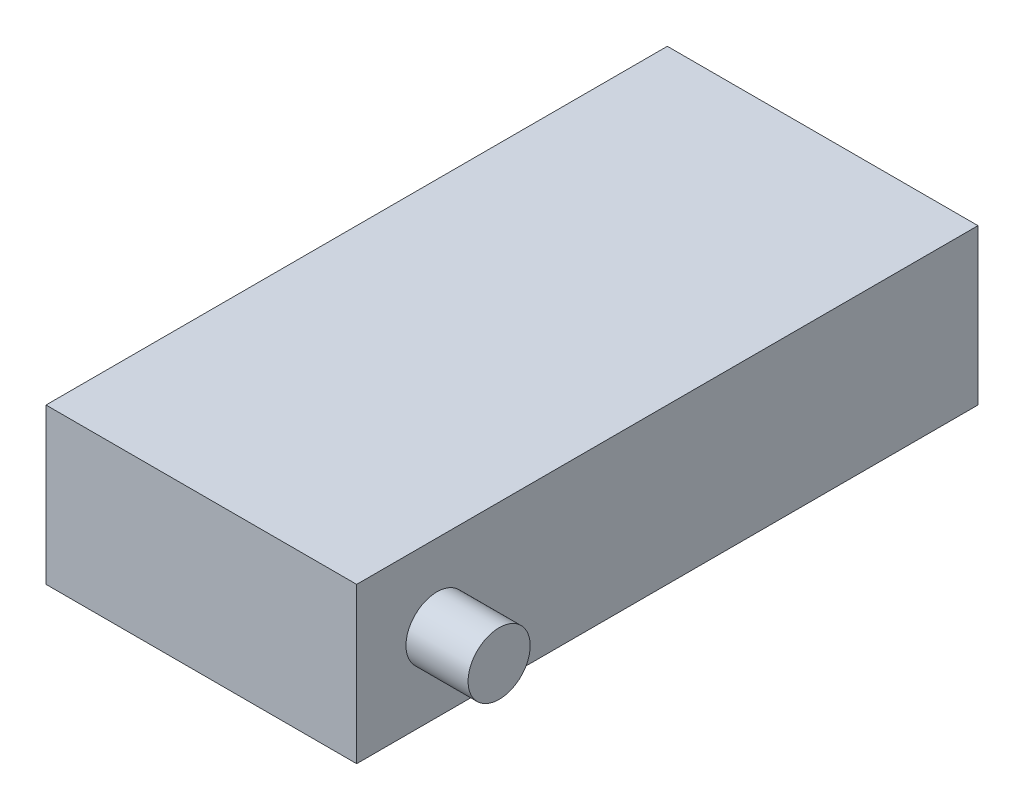
ISO-10303-21;
HEADER;
FILE_DESCRIPTION(('STEP AP214'),'2;1');
FILE_NAME('part.step','',(''),(''),'','','');
FILE_SCHEMA(('AUTOMOTIVE_DESIGN { 1 0 10303 214 1 1 1 1 }'));
ENDSEC;
DATA;
#1=APPLICATION_CONTEXT('core data for automotive mechanical design processes');
#2=APPLICATION_PROTOCOL_DEFINITION('international standard','automotive_design',2000,#1);
#3=PRODUCT_CONTEXT('',#1,'mechanical');
#4=PRODUCT('Part','Part','',(#3));
#5=PRODUCT_RELATED_PRODUCT_CATEGORY('part','',(#4));
#6=PRODUCT_DEFINITION_FORMATION('','',#4);
#7=PRODUCT_DEFINITION_CONTEXT('part definition',#1,'design');
#8=PRODUCT_DEFINITION('design','',#6,#7);
#9=PRODUCT_DEFINITION_SHAPE('','',#8);
#10=(LENGTH_UNIT() NAMED_UNIT(*) SI_UNIT(.MILLI.,.METRE.));
#11=(NAMED_UNIT(*) PLANE_ANGLE_UNIT() SI_UNIT($,.RADIAN.));
#12=(NAMED_UNIT(*) SI_UNIT($,.STERADIAN.) SOLID_ANGLE_UNIT());
#13=UNCERTAINTY_MEASURE_WITH_UNIT(LENGTH_MEASURE(1.E-05),#10,'distance_accuracy_value','');
#14=(GEOMETRIC_REPRESENTATION_CONTEXT(3) GLOBAL_UNCERTAINTY_ASSIGNED_CONTEXT((#13)) GLOBAL_UNIT_ASSIGNED_CONTEXT((#10,
#11,#12)) REPRESENTATION_CONTEXT('',''));
#15=CARTESIAN_POINT('',(0.,0.,0.));
#16=DIRECTION('',(0.,0.,1.));
#17=DIRECTION('',(1.,0.,0.));
#18=AXIS2_PLACEMENT_3D('',#15,#16,#17);
#19=CARTESIAN_POINT('',(20.,8.44636902789856,13.617404669199));
#20=DIRECTION('',(0.,0.,-1.));
#21=DIRECTION('',(-1.,0.,0.));
#22=AXIS2_PLACEMENT_3D('',#19,#20,#21);
#23=PLANE('',#22);
#24=DIRECTION('',(0.,-1.,0.));
#25=VECTOR('',#24,1.);
#26=CARTESIAN_POINT('',(0.,8.44636902789856,13.617404669199));
#27=LINE('',#26,#25);
#28=CARTESIAN_POINT('',(0.,8.44636902789856,13.617404669199));
#29=VERTEX_POINT('',#28);
#30=CARTESIAN_POINT('',(0.,-1.55363097210144,13.617404669199));
#31=VERTEX_POINT('',#30);
#32=EDGE_CURVE('E96',#29,#31,#27,.T.);
#33=ORIENTED_EDGE('',*,*,#32,.T.);
#34=DIRECTION('',(-1.,0.,0.));
#35=VECTOR('',#34,1.);
#36=CARTESIAN_POINT('',(20.,-1.55363097210144,13.617404669199));
#37=LINE('',#36,#35);
#38=CARTESIAN_POINT('',(20.,-1.55363097210144,13.617404669199));
#39=VERTEX_POINT('',#38);
#40=EDGE_CURVE('E11',#39,#31,#37,.T.);
#41=ORIENTED_EDGE('',*,*,#40,.F.);
#42=DIRECTION('',(0.,-1.,0.));
#43=VECTOR('',#42,1.);
#44=CARTESIAN_POINT('',(20.,8.44636902789856,13.617404669199));
#45=LINE('',#44,#43);
#46=CARTESIAN_POINT('',(20.,8.44636902789856,13.617404669199));
#47=VERTEX_POINT('',#46);
#48=EDGE_CURVE('E84',#47,#39,#45,.T.);
#49=ORIENTED_EDGE('',*,*,#48,.F.);
#50=DIRECTION('',(-1.,0.,0.));
#51=VECTOR('',#50,1.);
#52=CARTESIAN_POINT('',(20.,8.44636902789856,13.617404669199));
#53=LINE('',#52,#51);
#54=EDGE_CURVE('E92',#47,#29,#53,.T.);
#55=ORIENTED_EDGE('',*,*,#54,.T.);
#56=EDGE_LOOP('',(#33,#41,#49,#55));
#57=FACE_BOUND('',#56,.T.);
#58=ADVANCED_FACE('F33',(#57),#23,.F.);
#59=CARTESIAN_POINT('',(20.,-1.55363097210144,13.617404669199));
#60=DIRECTION('',(0.,1.,0.));
#61=DIRECTION('',(0.,0.,1.));
#62=AXIS2_PLACEMENT_3D('',#59,#60,#61);
#63=PLANE('',#62);
#64=DIRECTION('',(0.,0.,-1.));
#65=VECTOR('',#64,1.);
#66=CARTESIAN_POINT('',(0.,-1.55363097210144,13.617404669199));
#67=LINE('',#66,#65);
#68=CARTESIAN_POINT('',(0.,-1.55363097210144,-26.382595330801));
#69=VERTEX_POINT('',#68);
#70=EDGE_CURVE('E88',#31,#69,#67,.T.);
#71=ORIENTED_EDGE('',*,*,#70,.T.);
#72=DIRECTION('',(-1.,0.,0.));
#73=VECTOR('',#72,1.);
#74=CARTESIAN_POINT('',(20.,-1.55363097210144,-26.382595330801));
#75=LINE('',#74,#73);
#76=CARTESIAN_POINT('',(20.,-1.55363097210144,-26.382595330801));
#77=VERTEX_POINT('',#76);
#78=EDGE_CURVE('E41',#77,#69,#75,.T.);
#79=ORIENTED_EDGE('',*,*,#78,.F.);
#80=DIRECTION('',(0.,0.,-1.));
#81=VECTOR('',#80,1.);
#82=CARTESIAN_POINT('',(20.,-1.55363097210144,13.617404669199));
#83=LINE('',#82,#81);
#84=EDGE_CURVE('E79',#39,#77,#83,.T.);
#85=ORIENTED_EDGE('',*,*,#84,.F.);
#86=ORIENTED_EDGE('',*,*,#40,.T.);
#87=EDGE_LOOP('',(#71,#79,#85,#86));
#88=FACE_BOUND('',#87,.T.);
#89=ADVANCED_FACE('F87',(#88),#63,.F.);
#90=CARTESIAN_POINT('',(20.,8.44636902789856,-26.382595330801));
#91=DIRECTION('',(0.,0.,1.));
#92=DIRECTION('',(1.,0.,0.));
#93=AXIS2_PLACEMENT_3D('',#90,#91,#92);
#94=PLANE('',#93);
#95=DIRECTION('',(0.,1.,0.));
#96=VECTOR('',#95,1.);
#97=CARTESIAN_POINT('',(0.,8.44636902789856,-26.382595330801));
#98=LINE('',#97,#96);
#99=CARTESIAN_POINT('',(0.,8.44636902789856,-26.382595330801));
#100=VERTEX_POINT('',#99);
#101=EDGE_CURVE('E66',#69,#100,#98,.T.);
#102=ORIENTED_EDGE('',*,*,#101,.T.);
#103=DIRECTION('',(-1.,0.,0.));
#104=VECTOR('',#103,1.);
#105=CARTESIAN_POINT('',(20.,8.44636902789856,-26.382595330801));
#106=LINE('',#105,#104);
#107=CARTESIAN_POINT('',(20.,8.44636902789856,-26.382595330801));
#108=VERTEX_POINT('',#107);
#109=EDGE_CURVE('E89',#108,#100,#106,.T.);
#110=ORIENTED_EDGE('',*,*,#109,.F.);
#111=DIRECTION('',(0.,1.,0.));
#112=VECTOR('',#111,1.);
#113=CARTESIAN_POINT('',(20.,8.44636902789856,-26.382595330801));
#114=LINE('',#113,#112);
#115=EDGE_CURVE('E82',#77,#108,#114,.T.);
#116=ORIENTED_EDGE('',*,*,#115,.F.);
#117=ORIENTED_EDGE('',*,*,#78,.T.);
#118=EDGE_LOOP('',(#102,#110,#116,#117));
#119=FACE_BOUND('',#118,.T.);
#120=ADVANCED_FACE('F90',(#119),#94,.F.);
#121=CARTESIAN_POINT('',(20.,8.44636902789856,13.617404669199));
#122=DIRECTION('',(0.,-1.,0.));
#123=DIRECTION('',(0.,0.,-1.));
#124=AXIS2_PLACEMENT_3D('',#121,#122,#123);
#125=PLANE('',#124);
#126=DIRECTION('',(0.,0.,1.));
#127=VECTOR('',#126,1.);
#128=CARTESIAN_POINT('',(0.,8.44636902789856,13.617404669199));
#129=LINE('',#128,#127);
#130=EDGE_CURVE('E72',#100,#29,#129,.T.);
#131=ORIENTED_EDGE('',*,*,#130,.T.);
#132=ORIENTED_EDGE('',*,*,#54,.F.);
#133=DIRECTION('',(0.,0.,1.));
#134=VECTOR('',#133,1.);
#135=CARTESIAN_POINT('',(20.,8.44636902789856,13.617404669199));
#136=LINE('',#135,#134);
#137=EDGE_CURVE('E49',#108,#47,#136,.T.);
#138=ORIENTED_EDGE('',*,*,#137,.F.);
#139=ORIENTED_EDGE('',*,*,#109,.T.);
#140=EDGE_LOOP('',(#131,#132,#138,#139));
#141=FACE_BOUND('',#140,.T.);
#142=ADVANCED_FACE('F104',(#141),#125,.F.);
#143=CARTESIAN_POINT('',(20.,0.,0.));
#144=DIRECTION('',(1.,0.,0.));
#145=DIRECTION('',(0.,0.,-1.));
#146=AXIS2_PLACEMENT_3D('',#143,#144,#145);
#147=PLANE('',#146);
#148=CARTESIAN_POINT('',(20.,3.44636902789856,8.44508686981271));
#149=DIRECTION('',(1.,0.,0.));
#150=DIRECTION('',(0.,0.,-1.));
#151=AXIS2_PLACEMENT_3D('',#148,#149,#150);
#152=CIRCLE('',#151,2.);
#153=CARTESIAN_POINT('',(20.,3.44636902789856,6.44508686981271));
#154=VERTEX_POINT('',#153);
#155=EDGE_CURVE('E110',#154,#154,#152,.T.);
#156=ORIENTED_EDGE('',*,*,#155,.F.);
#157=EDGE_LOOP('',(#156));
#158=FACE_BOUND('',#157,.T.);
#159=ORIENTED_EDGE('',*,*,#48,.T.);
#160=ORIENTED_EDGE('',*,*,#84,.T.);
#161=ORIENTED_EDGE('',*,*,#115,.T.);
#162=ORIENTED_EDGE('',*,*,#137,.T.);
#163=EDGE_LOOP('',(#159,#160,#161,#162));
#164=FACE_BOUND('',#163,.T.);
#165=ADVANCED_FACE('F80',(#158,#164),#147,.T.);
#166=CARTESIAN_POINT('',(0.,0.,0.));
#167=DIRECTION('',(1.,0.,0.));
#168=DIRECTION('',(0.,0.,-1.));
#169=AXIS2_PLACEMENT_3D('',#166,#167,#168);
#170=PLANE('',#169);
#171=ORIENTED_EDGE('',*,*,#32,.F.);
#172=ORIENTED_EDGE('',*,*,#130,.F.);
#173=ORIENTED_EDGE('',*,*,#101,.F.);
#174=ORIENTED_EDGE('',*,*,#70,.F.);
#175=EDGE_LOOP('',(#171,#172,#173,#174));
#176=FACE_BOUND('',#175,.T.);
#177=ADVANCED_FACE('F107',(#176),#170,.F.);
#178=CARTESIAN_POINT('',(24.,3.44636902789856,8.44508686981271));
#179=DIRECTION('',(-1.,0.,0.));
#180=DIRECTION('',(0.,0.,1.));
#181=AXIS2_PLACEMENT_3D('',#178,#179,#180);
#182=CYLINDRICAL_SURFACE('',#181,2.);
#183=CARTESIAN_POINT('',(24.,3.44636902789856,8.44508686981271));
#184=DIRECTION('',(1.,0.,0.));
#185=DIRECTION('',(0.,0.,-1.));
#186=AXIS2_PLACEMENT_3D('',#183,#184,#185);
#187=CIRCLE('',#186,2.);
#188=CARTESIAN_POINT('',(24.,3.44636902789856,6.44508686981271));
#189=VERTEX_POINT('',#188);
#190=EDGE_CURVE('E99',#189,#189,#187,.T.);
#191=ORIENTED_EDGE('',*,*,#190,.F.);
#192=EDGE_LOOP('',(#191));
#193=FACE_BOUND('',#192,.T.);
#194=ORIENTED_EDGE('',*,*,#155,.T.);
#195=EDGE_LOOP('',(#194));
#196=FACE_BOUND('',#195,.T.);
#197=ADVANCED_FACE('F118',(#193,#196),#182,.T.);
#198=CARTESIAN_POINT('',(24.,3.44636902789856,8.44508686981271));
#199=DIRECTION('',(1.,0.,0.));
#200=DIRECTION('',(0.,0.,-1.));
#201=AXIS2_PLACEMENT_3D('',#198,#199,#200);
#202=PLANE('',#201);
#203=ORIENTED_EDGE('',*,*,#190,.T.);
#204=EDGE_LOOP('',(#203));
#205=FACE_BOUND('',#204,.T.);
#206=ADVANCED_FACE('F116',(#205),#202,.T.);
#207=CLOSED_SHELL('',(#58,#89,#120,#142,#165,#177,#197,#206));
#208=MANIFOLD_SOLID_BREP('B2',#207);
#209=ADVANCED_BREP_SHAPE_REPRESENTATION('',(#18,#208),#14);
#210=SHAPE_DEFINITION_REPRESENTATION(#9,#209);
ENDSEC;
END-ISO-10303-21;
